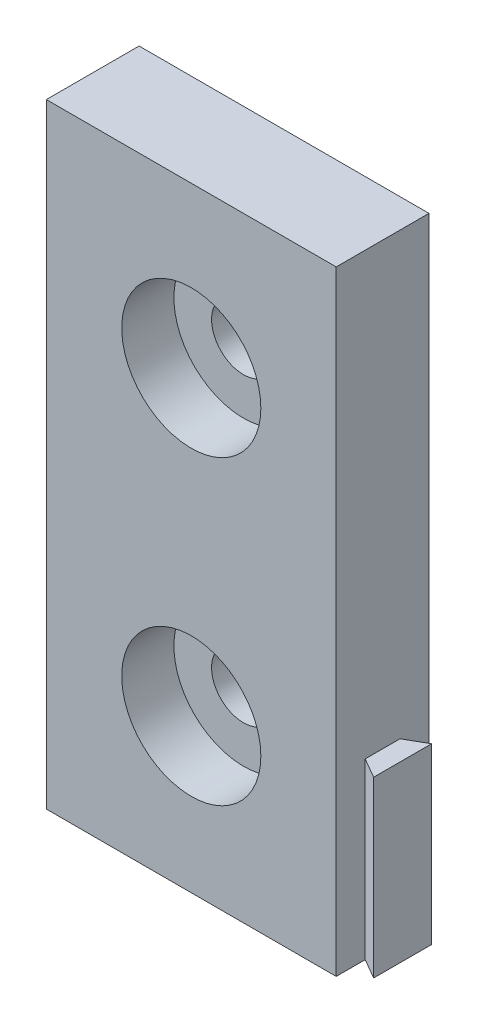
ISO-10303-21;
HEADER;
FILE_DESCRIPTION(('STEP AP214'),'2;1');
FILE_NAME('part.step','',(''),(''),'','','');
FILE_SCHEMA(('AUTOMOTIVE_DESIGN { 1 0 10303 214 1 1 1 1 }'));
ENDSEC;
DATA;
#1=APPLICATION_CONTEXT('core data for automotive mechanical design processes');
#2=APPLICATION_PROTOCOL_DEFINITION('international standard','automotive_design',2000,#1);
#3=PRODUCT_CONTEXT('',#1,'mechanical');
#4=PRODUCT('Part','Part','',(#3));
#5=PRODUCT_RELATED_PRODUCT_CATEGORY('part','',(#4));
#6=PRODUCT_DEFINITION_FORMATION('','',#4);
#7=PRODUCT_DEFINITION_CONTEXT('part definition',#1,'design');
#8=PRODUCT_DEFINITION('design','',#6,#7);
#9=PRODUCT_DEFINITION_SHAPE('','',#8);
#10=(LENGTH_UNIT() NAMED_UNIT(*) SI_UNIT(.MILLI.,.METRE.));
#11=(NAMED_UNIT(*) PLANE_ANGLE_UNIT() SI_UNIT($,.RADIAN.));
#12=(NAMED_UNIT(*) SI_UNIT($,.STERADIAN.) SOLID_ANGLE_UNIT());
#13=UNCERTAINTY_MEASURE_WITH_UNIT(LENGTH_MEASURE(1.E-05),#10,'distance_accuracy_value','');
#14=(GEOMETRIC_REPRESENTATION_CONTEXT(3) GLOBAL_UNCERTAINTY_ASSIGNED_CONTEXT((#13)) GLOBAL_UNIT_ASSIGNED_CONTEXT((#10,
#11,#12)) REPRESENTATION_CONTEXT('',''));
#15=CARTESIAN_POINT('',(0.,0.,0.));
#16=DIRECTION('',(0.,0.,1.));
#17=DIRECTION('',(1.,0.,0.));
#18=AXIS2_PLACEMENT_3D('',#15,#16,#17);
#19=CARTESIAN_POINT('',(12.5,39.2,8.));
#20=DIRECTION('',(0.,0.,-1.));
#21=DIRECTION('',(-1.,0.,0.));
#22=AXIS2_PLACEMENT_3D('',#19,#20,#21);
#23=CYLINDRICAL_SURFACE('',#22,2.75);
#24=CARTESIAN_POINT('',(12.5,39.2,0.));
#25=DIRECTION('',(0.,0.,1.));
#26=DIRECTION('',(1.,0.,0.));
#27=AXIS2_PLACEMENT_3D('',#24,#25,#26);
#28=CIRCLE('',#27,2.75);
#29=CARTESIAN_POINT('',(15.25,39.2,0.));
#30=VERTEX_POINT('',#29);
#31=EDGE_CURVE('E172',#30,#30,#28,.T.);
#32=ORIENTED_EDGE('',*,*,#31,.F.);
#33=EDGE_LOOP('',(#32));
#34=FACE_BOUND('',#33,.T.);
#35=CARTESIAN_POINT('',(12.5,39.2,3.5));
#36=DIRECTION('',(0.,0.,1.));
#37=DIRECTION('',(1.,0.,0.));
#38=AXIS2_PLACEMENT_3D('',#35,#36,#37);
#39=CIRCLE('',#38,2.75);
#40=CARTESIAN_POINT('',(15.25,39.2,3.5));
#41=VERTEX_POINT('',#40);
#42=EDGE_CURVE('E44',#41,#41,#39,.T.);
#43=ORIENTED_EDGE('',*,*,#42,.T.);
#44=EDGE_LOOP('',(#43));
#45=FACE_BOUND('',#44,.T.);
#46=ADVANCED_FACE('F40',(#34,#45),#23,.F.);
#47=CARTESIAN_POINT('',(12.5,13.2,8.));
#48=DIRECTION('',(0.,0.,-1.));
#49=DIRECTION('',(-1.,0.,0.));
#50=AXIS2_PLACEMENT_3D('',#47,#48,#49);
#51=CYLINDRICAL_SURFACE('',#50,2.75);
#52=CARTESIAN_POINT('',(12.5,13.2,0.));
#53=DIRECTION('',(0.,0.,1.));
#54=DIRECTION('',(1.,0.,0.));
#55=AXIS2_PLACEMENT_3D('',#52,#53,#54);
#56=CIRCLE('',#55,2.75);
#57=CARTESIAN_POINT('',(15.25,13.2,0.));
#58=VERTEX_POINT('',#57);
#59=EDGE_CURVE('E163',#58,#58,#56,.T.);
#60=ORIENTED_EDGE('',*,*,#59,.F.);
#61=EDGE_LOOP('',(#60));
#62=FACE_BOUND('',#61,.T.);
#63=CARTESIAN_POINT('',(12.5,13.2,3.5));
#64=DIRECTION('',(0.,0.,1.));
#65=DIRECTION('',(1.,0.,0.));
#66=AXIS2_PLACEMENT_3D('',#63,#64,#65);
#67=CIRCLE('',#66,2.75);
#68=CARTESIAN_POINT('',(15.25,13.2,3.5));
#69=VERTEX_POINT('',#68);
#70=EDGE_CURVE('E207',#69,#69,#67,.T.);
#71=ORIENTED_EDGE('',*,*,#70,.T.);
#72=EDGE_LOOP('',(#71));
#73=FACE_BOUND('',#72,.T.);
#74=ADVANCED_FACE('F264',(#62,#73),#51,.F.);
#75=CARTESIAN_POINT('',(25.,0.,8.));
#76=DIRECTION('',(-1.,0.,0.));
#77=DIRECTION('',(0.,-1.,0.));
#78=AXIS2_PLACEMENT_3D('',#75,#76,#77);
#79=PLANE('',#78);
#80=DIRECTION('',(0.,-1.,0.));
#81=VECTOR('',#80,1.);
#82=CARTESIAN_POINT('',(25.,15.,5.5));
#83=LINE('',#82,#81);
#84=CARTESIAN_POINT('',(25.,15.,5.5));
#85=VERTEX_POINT('',#84);
#86=CARTESIAN_POINT('',(25.,0.,5.5));
#87=VERTEX_POINT('',#86);
#88=EDGE_CURVE('E139',#85,#87,#83,.T.);
#89=ORIENTED_EDGE('',*,*,#88,.F.);
#90=DIRECTION('',(0.,0.,-1.));
#91=VECTOR('',#90,1.);
#92=CARTESIAN_POINT('',(25.,15.,2.5));
#93=LINE('',#92,#91);
#94=CARTESIAN_POINT('',(25.,15.,2.5));
#95=VERTEX_POINT('',#94);
#96=EDGE_CURVE('E130',#85,#95,#93,.T.);
#97=ORIENTED_EDGE('',*,*,#96,.T.);
#98=DIRECTION('',(0.,-1.,0.));
#99=VECTOR('',#98,1.);
#100=CARTESIAN_POINT('',(25.,15.,2.5));
#101=LINE('',#100,#99);
#102=CARTESIAN_POINT('',(25.,0.,2.5));
#103=VERTEX_POINT('',#102);
#104=EDGE_CURVE('E115',#95,#103,#101,.T.);
#105=ORIENTED_EDGE('',*,*,#104,.T.);
#106=DIRECTION('',(0.,0.,-1.));
#107=VECTOR('',#106,1.);
#108=CARTESIAN_POINT('',(25.,0.,8.));
#109=LINE('',#108,#107);
#110=CARTESIAN_POINT('',(25.,0.,0.));
#111=VERTEX_POINT('',#110);
#112=EDGE_CURVE('E205',#103,#111,#109,.T.);
#113=ORIENTED_EDGE('',*,*,#112,.T.);
#114=DIRECTION('',(0.,1.,0.));
#115=VECTOR('',#114,1.);
#116=CARTESIAN_POINT('',(25.,0.,0.));
#117=LINE('',#116,#115);
#118=CARTESIAN_POINT('',(25.,53.,0.));
#119=VERTEX_POINT('',#118);
#120=EDGE_CURVE('E195',#111,#119,#117,.T.);
#121=ORIENTED_EDGE('',*,*,#120,.T.);
#122=DIRECTION('',(0.,0.,-1.));
#123=VECTOR('',#122,1.);
#124=CARTESIAN_POINT('',(25.,53.,8.));
#125=LINE('',#124,#123);
#126=CARTESIAN_POINT('',(25.,53.,8.));
#127=VERTEX_POINT('',#126);
#128=EDGE_CURVE('E202',#127,#119,#125,.T.);
#129=ORIENTED_EDGE('',*,*,#128,.F.);
#130=DIRECTION('',(0.,1.,0.));
#131=VECTOR('',#130,1.);
#132=CARTESIAN_POINT('',(25.,0.,8.));
#133=LINE('',#132,#131);
#134=CARTESIAN_POINT('',(25.,0.,8.));
#135=VERTEX_POINT('',#134);
#136=EDGE_CURVE('E182',#135,#127,#133,.T.);
#137=ORIENTED_EDGE('',*,*,#136,.F.);
#138=EDGE_CURVE('E50',#135,#87,#109,.T.);
#139=ORIENTED_EDGE('',*,*,#138,.T.);
#140=EDGE_LOOP('',(#89,#97,#105,#113,#121,#129,#137,#139));
#141=FACE_BOUND('',#140,.T.);
#142=ADVANCED_FACE('F137',(#141),#79,.F.);
#143=CARTESIAN_POINT('',(0.,0.,8.));
#144=DIRECTION('',(0.,0.,-1.));
#145=DIRECTION('',(-1.,0.,0.));
#146=AXIS2_PLACEMENT_3D('',#143,#144,#145);
#147=PLANE('',#146);
#148=CARTESIAN_POINT('',(12.5,39.2,8.));
#149=DIRECTION('',(0.,0.,1.));
#150=DIRECTION('',(1.,0.,0.));
#151=AXIS2_PLACEMENT_3D('',#148,#149,#150);
#152=CIRCLE('',#151,6.);
#153=CARTESIAN_POINT('',(18.5,39.2,8.));
#154=VERTEX_POINT('',#153);
#155=EDGE_CURVE('E216',#154,#154,#152,.T.);
#156=ORIENTED_EDGE('',*,*,#155,.F.);
#157=EDGE_LOOP('',(#156));
#158=FACE_BOUND('',#157,.T.);
#159=CARTESIAN_POINT('',(12.5,13.2,8.));
#160=DIRECTION('',(0.,0.,1.));
#161=DIRECTION('',(1.,0.,0.));
#162=AXIS2_PLACEMENT_3D('',#159,#160,#161);
#163=CIRCLE('',#162,6.);
#164=CARTESIAN_POINT('',(18.5,13.2,8.));
#165=VERTEX_POINT('',#164);
#166=EDGE_CURVE('E150',#165,#165,#163,.T.);
#167=ORIENTED_EDGE('',*,*,#166,.F.);
#168=EDGE_LOOP('',(#167));
#169=FACE_BOUND('',#168,.T.);
#170=DIRECTION('',(0.,-1.,0.));
#171=VECTOR('',#170,1.);
#172=CARTESIAN_POINT('',(0.,0.,8.));
#173=LINE('',#172,#171);
#174=CARTESIAN_POINT('',(0.,53.,8.));
#175=VERTEX_POINT('',#174);
#176=CARTESIAN_POINT('',(0.,0.,8.));
#177=VERTEX_POINT('',#176);
#178=EDGE_CURVE('E177',#175,#177,#173,.T.);
#179=ORIENTED_EDGE('',*,*,#178,.T.);
#180=DIRECTION('',(1.,0.,0.));
#181=VECTOR('',#180,1.);
#182=CARTESIAN_POINT('',(0.,0.,8.));
#183=LINE('',#182,#181);
#184=EDGE_CURVE('E95',#177,#135,#183,.T.);
#185=ORIENTED_EDGE('',*,*,#184,.T.);
#186=ORIENTED_EDGE('',*,*,#136,.T.);
#187=DIRECTION('',(-1.,0.,0.));
#188=VECTOR('',#187,1.);
#189=CARTESIAN_POINT('',(0.,53.,8.));
#190=LINE('',#189,#188);
#191=EDGE_CURVE('E67',#127,#175,#190,.T.);
#192=ORIENTED_EDGE('',*,*,#191,.T.);
#193=EDGE_LOOP('',(#179,#185,#186,#192));
#194=FACE_BOUND('',#193,.T.);
#195=ADVANCED_FACE('F235',(#158,#169,#194),#147,.F.);
#196=CARTESIAN_POINT('',(0.,0.,0.));
#197=DIRECTION('',(0.,0.,-1.));
#198=DIRECTION('',(-1.,0.,0.));
#199=AXIS2_PLACEMENT_3D('',#196,#197,#198);
#200=PLANE('',#199);
#201=ORIENTED_EDGE('',*,*,#31,.T.);
#202=EDGE_LOOP('',(#201));
#203=FACE_BOUND('',#202,.T.);
#204=DIRECTION('',(0.,-1.,0.));
#205=VECTOR('',#204,1.);
#206=CARTESIAN_POINT('',(0.,0.,0.));
#207=LINE('',#206,#205);
#208=CARTESIAN_POINT('',(0.,53.,0.));
#209=VERTEX_POINT('',#208);
#210=CARTESIAN_POINT('',(0.,0.,0.));
#211=VERTEX_POINT('',#210);
#212=EDGE_CURVE('E176',#209,#211,#207,.T.);
#213=ORIENTED_EDGE('',*,*,#212,.F.);
#214=DIRECTION('',(-1.,0.,0.));
#215=VECTOR('',#214,1.);
#216=CARTESIAN_POINT('',(0.,53.,0.));
#217=LINE('',#216,#215);
#218=EDGE_CURVE('E88',#119,#209,#217,.T.);
#219=ORIENTED_EDGE('',*,*,#218,.F.);
#220=ORIENTED_EDGE('',*,*,#120,.F.);
#221=DIRECTION('',(1.,0.,0.));
#222=VECTOR('',#221,1.);
#223=CARTESIAN_POINT('',(0.,0.,0.));
#224=LINE('',#223,#222);
#225=EDGE_CURVE('E191',#211,#111,#224,.T.);
#226=ORIENTED_EDGE('',*,*,#225,.F.);
#227=EDGE_LOOP('',(#213,#219,#220,#226));
#228=FACE_BOUND('',#227,.T.);
#229=ORIENTED_EDGE('',*,*,#59,.T.);
#230=EDGE_LOOP('',(#229));
#231=FACE_BOUND('',#230,.T.);
#232=ADVANCED_FACE('F237',(#203,#228,#231),#200,.T.);
#233=CARTESIAN_POINT('',(0.,0.,8.));
#234=DIRECTION('',(1.,0.,0.));
#235=DIRECTION('',(0.,1.,0.));
#236=AXIS2_PLACEMENT_3D('',#233,#234,#235);
#237=PLANE('',#236);
#238=ORIENTED_EDGE('',*,*,#212,.T.);
#239=DIRECTION('',(0.,0.,-1.));
#240=VECTOR('',#239,1.);
#241=CARTESIAN_POINT('',(0.,0.,8.));
#242=LINE('',#241,#240);
#243=EDGE_CURVE('E11',#177,#211,#242,.T.);
#244=ORIENTED_EDGE('',*,*,#243,.F.);
#245=ORIENTED_EDGE('',*,*,#178,.F.);
#246=DIRECTION('',(0.,0.,-1.));
#247=VECTOR('',#246,1.);
#248=CARTESIAN_POINT('',(0.,53.,8.));
#249=LINE('',#248,#247);
#250=EDGE_CURVE('E187',#175,#209,#249,.T.);
#251=ORIENTED_EDGE('',*,*,#250,.T.);
#252=EDGE_LOOP('',(#238,#244,#245,#251));
#253=FACE_BOUND('',#252,.T.);
#254=ADVANCED_FACE('F42',(#253),#237,.F.);
#255=CARTESIAN_POINT('',(0.,0.,8.));
#256=DIRECTION('',(0.,1.,0.));
#257=DIRECTION('',(0.,0.,1.));
#258=AXIS2_PLACEMENT_3D('',#255,#256,#257);
#259=PLANE('',#258);
#260=ORIENTED_EDGE('',*,*,#225,.T.);
#261=ORIENTED_EDGE('',*,*,#112,.F.);
#262=DIRECTION('',(0.86602540378444,0.,-0.499999999999998));
#263=VECTOR('',#262,1.);
#264=CARTESIAN_POINT('',(25.,0.,2.5));
#265=LINE('',#264,#263);
#266=CARTESIAN_POINT('',(26.7320508075689,0.,1.5));
#267=VERTEX_POINT('',#266);
#268=EDGE_CURVE('E58',#103,#267,#265,.T.);
#269=ORIENTED_EDGE('',*,*,#268,.T.);
#270=DIRECTION('',(0.,0.,1.));
#271=VECTOR('',#270,1.);
#272=CARTESIAN_POINT('',(26.7320508075689,0.,1.5));
#273=LINE('',#272,#271);
#274=CARTESIAN_POINT('',(26.7320508075689,0.,6.5));
#275=VERTEX_POINT('',#274);
#276=EDGE_CURVE('E147',#267,#275,#273,.T.);
#277=ORIENTED_EDGE('',*,*,#276,.T.);
#278=DIRECTION('',(-0.866025403784439,0.,-0.499999999999998));
#279=VECTOR('',#278,1.);
#280=CARTESIAN_POINT('',(26.7320508075689,0.,6.5));
#281=LINE('',#280,#279);
#282=EDGE_CURVE('E141',#275,#87,#281,.T.);
#283=ORIENTED_EDGE('',*,*,#282,.T.);
#284=ORIENTED_EDGE('',*,*,#138,.F.);
#285=ORIENTED_EDGE('',*,*,#184,.F.);
#286=ORIENTED_EDGE('',*,*,#243,.T.);
#287=EDGE_LOOP('',(#260,#261,#269,#277,#283,#284,#285,#286));
#288=FACE_BOUND('',#287,.T.);
#289=ADVANCED_FACE('F244',(#288),#259,.F.);
#290=CARTESIAN_POINT('',(0.,53.,8.));
#291=DIRECTION('',(0.,-1.,0.));
#292=DIRECTION('',(0.,0.,-1.));
#293=AXIS2_PLACEMENT_3D('',#290,#291,#292);
#294=PLANE('',#293);
#295=ORIENTED_EDGE('',*,*,#218,.T.);
#296=ORIENTED_EDGE('',*,*,#250,.F.);
#297=ORIENTED_EDGE('',*,*,#191,.F.);
#298=ORIENTED_EDGE('',*,*,#128,.T.);
#299=EDGE_LOOP('',(#295,#296,#297,#298));
#300=FACE_BOUND('',#299,.T.);
#301=ADVANCED_FACE('F250',(#300),#294,.F.);
#302=CARTESIAN_POINT('',(26.7320508075689,15.,6.5));
#303=DIRECTION('',(-0.499999999999998,0.,0.866025403784439));
#304=DIRECTION('',(0.86602540378444,0.,0.499999999999999));
#305=AXIS2_PLACEMENT_3D('',#302,#303,#304);
#306=PLANE('',#305);
#307=ORIENTED_EDGE('',*,*,#282,.F.);
#308=DIRECTION('',(0.,-1.,0.));
#309=VECTOR('',#308,1.);
#310=CARTESIAN_POINT('',(26.7320508075689,15.,6.5));
#311=LINE('',#310,#309);
#312=CARTESIAN_POINT('',(26.7320508075689,15.,6.5));
#313=VERTEX_POINT('',#312);
#314=EDGE_CURVE('E164',#313,#275,#311,.T.);
#315=ORIENTED_EDGE('',*,*,#314,.F.);
#316=DIRECTION('',(-0.866025403784439,0.,-0.499999999999998));
#317=VECTOR('',#316,1.);
#318=CARTESIAN_POINT('',(26.7320508075689,15.,6.5));
#319=LINE('',#318,#317);
#320=EDGE_CURVE('E124',#313,#85,#319,.T.);
#321=ORIENTED_EDGE('',*,*,#320,.T.);
#322=ORIENTED_EDGE('',*,*,#88,.T.);
#323=EDGE_LOOP('',(#307,#315,#321,#322));
#324=FACE_BOUND('',#323,.T.);
#325=ADVANCED_FACE('F252',(#324),#306,.T.);
#326=CARTESIAN_POINT('',(26.7320508075689,15.,1.5));
#327=DIRECTION('',(1.,0.,0.));
#328=DIRECTION('',(0.,0.,-1.));
#329=AXIS2_PLACEMENT_3D('',#326,#327,#328);
#330=PLANE('',#329);
#331=ORIENTED_EDGE('',*,*,#276,.F.);
#332=DIRECTION('',(0.,-1.,0.));
#333=VECTOR('',#332,1.);
#334=CARTESIAN_POINT('',(26.7320508075689,15.,1.5));
#335=LINE('',#334,#333);
#336=CARTESIAN_POINT('',(26.7320508075689,15.,1.5));
#337=VERTEX_POINT('',#336);
#338=EDGE_CURVE('E123',#337,#267,#335,.T.);
#339=ORIENTED_EDGE('',*,*,#338,.F.);
#340=DIRECTION('',(0.,0.,1.));
#341=VECTOR('',#340,1.);
#342=CARTESIAN_POINT('',(26.7320508075689,15.,1.5));
#343=LINE('',#342,#341);
#344=EDGE_CURVE('E133',#337,#313,#343,.T.);
#345=ORIENTED_EDGE('',*,*,#344,.T.);
#346=ORIENTED_EDGE('',*,*,#314,.T.);
#347=EDGE_LOOP('',(#331,#339,#345,#346));
#348=FACE_BOUND('',#347,.T.);
#349=ADVANCED_FACE('F258',(#348),#330,.T.);
#350=CARTESIAN_POINT('',(25.,15.,2.5));
#351=DIRECTION('',(-0.499999999999998,0.,-0.86602540378444));
#352=DIRECTION('',(-0.86602540378444,0.,0.499999999999998));
#353=AXIS2_PLACEMENT_3D('',#350,#351,#352);
#354=PLANE('',#353);
#355=ORIENTED_EDGE('',*,*,#268,.F.);
#356=ORIENTED_EDGE('',*,*,#104,.F.);
#357=DIRECTION('',(0.86602540378444,0.,-0.499999999999998));
#358=VECTOR('',#357,1.);
#359=CARTESIAN_POINT('',(25.,15.,2.5));
#360=LINE('',#359,#358);
#361=EDGE_CURVE('E118',#95,#337,#360,.T.);
#362=ORIENTED_EDGE('',*,*,#361,.T.);
#363=ORIENTED_EDGE('',*,*,#338,.T.);
#364=EDGE_LOOP('',(#355,#356,#362,#363));
#365=FACE_BOUND('',#364,.T.);
#366=ADVANCED_FACE('F117',(#365),#354,.T.);
#367=CARTESIAN_POINT('',(0.,15.,0.));
#368=DIRECTION('',(0.,-1.,0.));
#369=DIRECTION('',(0.,0.,-1.));
#370=AXIS2_PLACEMENT_3D('',#367,#368,#369);
#371=PLANE('',#370);
#372=ORIENTED_EDGE('',*,*,#96,.F.);
#373=ORIENTED_EDGE('',*,*,#320,.F.);
#374=ORIENTED_EDGE('',*,*,#344,.F.);
#375=ORIENTED_EDGE('',*,*,#361,.F.);
#376=EDGE_LOOP('',(#372,#373,#374,#375));
#377=FACE_BOUND('',#376,.T.);
#378=ADVANCED_FACE('F128',(#377),#371,.F.);
#379=CARTESIAN_POINT('',(12.5,13.2,3.5));
#380=DIRECTION('',(0.,0.,1.));
#381=DIRECTION('',(1.,0.,0.));
#382=AXIS2_PLACEMENT_3D('',#379,#380,#381);
#383=CYLINDRICAL_SURFACE('',#382,6.);
#384=CARTESIAN_POINT('',(12.5,13.2,3.5));
#385=DIRECTION('',(0.,0.,1.));
#386=DIRECTION('',(1.,0.,0.));
#387=AXIS2_PLACEMENT_3D('',#384,#385,#386);
#388=CIRCLE('',#387,6.);
#389=CARTESIAN_POINT('',(18.5,13.2,3.5));
#390=VERTEX_POINT('',#389);
#391=EDGE_CURVE('E223',#390,#390,#388,.T.);
#392=ORIENTED_EDGE('',*,*,#391,.F.);
#393=EDGE_LOOP('',(#392));
#394=FACE_BOUND('',#393,.T.);
#395=ORIENTED_EDGE('',*,*,#166,.T.);
#396=EDGE_LOOP('',(#395));
#397=FACE_BOUND('',#396,.T.);
#398=ADVANCED_FACE('F233',(#394,#397),#383,.F.);
#399=CARTESIAN_POINT('',(12.5,13.2,3.5));
#400=DIRECTION('',(0.,0.,1.));
#401=DIRECTION('',(1.,0.,0.));
#402=AXIS2_PLACEMENT_3D('',#399,#400,#401);
#403=PLANE('',#402);
#404=ORIENTED_EDGE('',*,*,#70,.F.);
#405=EDGE_LOOP('',(#404));
#406=FACE_BOUND('',#405,.T.);
#407=ORIENTED_EDGE('',*,*,#391,.T.);
#408=EDGE_LOOP('',(#407));
#409=FACE_BOUND('',#408,.T.);
#410=ADVANCED_FACE('F323',(#406,#409),#403,.T.);
#411=CARTESIAN_POINT('',(12.5,39.2,3.5));
#412=DIRECTION('',(0.,0.,1.));
#413=DIRECTION('',(1.,0.,0.));
#414=AXIS2_PLACEMENT_3D('',#411,#412,#413);
#415=CYLINDRICAL_SURFACE('',#414,6.);
#416=CARTESIAN_POINT('',(12.5,39.2,3.5));
#417=DIRECTION('',(0.,0.,1.));
#418=DIRECTION('',(1.,0.,0.));
#419=AXIS2_PLACEMENT_3D('',#416,#417,#418);
#420=CIRCLE('',#419,6.);
#421=CARTESIAN_POINT('',(18.5,39.2,3.5));
#422=VERTEX_POINT('',#421);
#423=EDGE_CURVE('E210',#422,#422,#420,.T.);
#424=ORIENTED_EDGE('',*,*,#423,.F.);
#425=EDGE_LOOP('',(#424));
#426=FACE_BOUND('',#425,.T.);
#427=ORIENTED_EDGE('',*,*,#155,.T.);
#428=EDGE_LOOP('',(#427));
#429=FACE_BOUND('',#428,.T.);
#430=ADVANCED_FACE('F333',(#426,#429),#415,.F.);
#431=CARTESIAN_POINT('',(12.5,39.2,3.5));
#432=DIRECTION('',(0.,0.,1.));
#433=DIRECTION('',(1.,0.,0.));
#434=AXIS2_PLACEMENT_3D('',#431,#432,#433);
#435=PLANE('',#434);
#436=ORIENTED_EDGE('',*,*,#42,.F.);
#437=EDGE_LOOP('',(#436));
#438=FACE_BOUND('',#437,.T.);
#439=ORIENTED_EDGE('',*,*,#423,.T.);
#440=EDGE_LOOP('',(#439));
#441=FACE_BOUND('',#440,.T.);
#442=ADVANCED_FACE('F342',(#438,#441),#435,.T.);
#443=CLOSED_SHELL('',(#46,#74,#142,#195,#232,#254,#289,#301,#325,#349,#366,#378,#398,#410,#430,#442));
#444=MANIFOLD_SOLID_BREP('B2',#443);
#445=ADVANCED_BREP_SHAPE_REPRESENTATION('',(#18,#444),#14);
#446=SHAPE_DEFINITION_REPRESENTATION(#9,#445);
ENDSEC;
END-ISO-10303-21;
